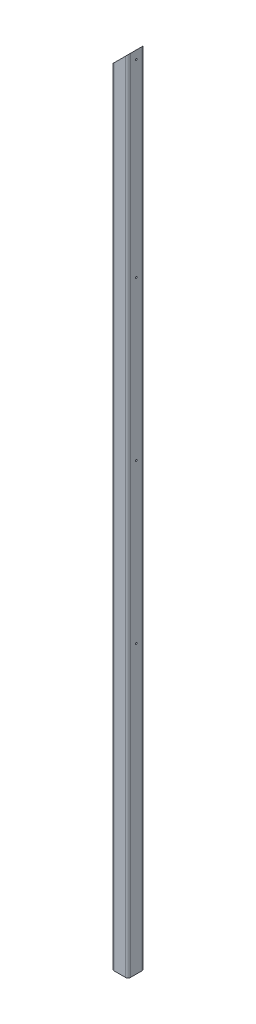
ISO-10303-21;
HEADER;
FILE_DESCRIPTION(('STEP AP214'),'2;1');
FILE_NAME('part.step','',(''),(''),'','','');
FILE_SCHEMA(('AUTOMOTIVE_DESIGN { 1 0 10303 214 1 1 1 1 }'));
ENDSEC;
DATA;
#1=APPLICATION_CONTEXT('core data for automotive mechanical design processes');
#2=APPLICATION_PROTOCOL_DEFINITION('international standard','automotive_design',2000,#1);
#3=PRODUCT_CONTEXT('',#1,'mechanical');
#4=PRODUCT('Part','Part','',(#3));
#5=PRODUCT_RELATED_PRODUCT_CATEGORY('part','',(#4));
#6=PRODUCT_DEFINITION_FORMATION('','',#4);
#7=PRODUCT_DEFINITION_CONTEXT('part definition',#1,'design');
#8=PRODUCT_DEFINITION('design','',#6,#7);
#9=PRODUCT_DEFINITION_SHAPE('','',#8);
#10=(LENGTH_UNIT() NAMED_UNIT(*) SI_UNIT(.MILLI.,.METRE.));
#11=(NAMED_UNIT(*) PLANE_ANGLE_UNIT() SI_UNIT($,.RADIAN.));
#12=(NAMED_UNIT(*) SI_UNIT($,.STERADIAN.) SOLID_ANGLE_UNIT());
#13=UNCERTAINTY_MEASURE_WITH_UNIT(LENGTH_MEASURE(1.E-05),#10,'distance_accuracy_value','');
#14=(GEOMETRIC_REPRESENTATION_CONTEXT(3) GLOBAL_UNCERTAINTY_ASSIGNED_CONTEXT((#13)) GLOBAL_UNIT_ASSIGNED_CONTEXT((#10,
#11,#12)) REPRESENTATION_CONTEXT('',''));
#15=CARTESIAN_POINT('',(0.,0.,0.));
#16=DIRECTION('',(0.,0.,1.));
#17=DIRECTION('',(1.,0.,0.));
#18=AXIS2_PLACEMENT_3D('',#15,#16,#17);
#19=CARTESIAN_POINT('',(-13.6,1920.,13.6));
#20=DIRECTION('',(0.,-1.,0.));
#21=DIRECTION('',(0.,0.,-1.));
#22=AXIS2_PLACEMENT_3D('',#19,#20,#21);
#23=CYLINDRICAL_SURFACE('',#22,6.4);
#24=CARTESIAN_POINT('',(-13.6,1886.4,13.6));
#25=DIRECTION('',(-0.707106781186548,0.707106781186547,0.));
#26=DIRECTION('',(-0.707106781186547,-0.707106781186548,0.));
#27=AXIS2_PLACEMENT_3D('',#24,#25,#26);
#28=ELLIPSE('',#27,9.05096679918782,6.4);
#29=CARTESIAN_POINT('',(-20.,1880.,13.6));
#30=VERTEX_POINT('',#29);
#31=CARTESIAN_POINT('',(-13.5999999999999,1886.4,20.));
#32=VERTEX_POINT('',#31);
#33=EDGE_CURVE('E245',#30,#32,#28,.T.);
#34=ORIENTED_EDGE('',*,*,#33,.F.);
#35=DIRECTION('',(0.,-1.,0.));
#36=VECTOR('',#35,1.);
#37=CARTESIAN_POINT('',(-20.,1920.,13.6));
#38=LINE('',#37,#36);
#39=CARTESIAN_POINT('',(-20.,0.,13.6));
#40=VERTEX_POINT('',#39);
#41=EDGE_CURVE('E161',#30,#40,#38,.T.);
#42=ORIENTED_EDGE('',*,*,#41,.T.);
#43=CARTESIAN_POINT('',(-13.6,0.,13.6));
#44=DIRECTION('',(0.,1.,0.));
#45=DIRECTION('',(0.,0.,1.));
#46=AXIS2_PLACEMENT_3D('',#43,#44,#45);
#47=CIRCLE('',#46,6.4);
#48=CARTESIAN_POINT('',(-13.6,0.,20.));
#49=VERTEX_POINT('',#48);
#50=EDGE_CURVE('E176',#40,#49,#47,.T.);
#51=ORIENTED_EDGE('',*,*,#50,.T.);
#52=DIRECTION('',(0.,-1.,0.));
#53=VECTOR('',#52,1.);
#54=CARTESIAN_POINT('',(-13.6,1920.,20.));
#55=LINE('',#54,#53);
#56=EDGE_CURVE('E12',#32,#49,#55,.T.);
#57=ORIENTED_EDGE('',*,*,#56,.F.);
#58=EDGE_LOOP('',(#34,#42,#51,#57));
#59=FACE_BOUND('',#58,.T.);
#60=ADVANCED_FACE('F66',(#59),#23,.T.);
#61=CARTESIAN_POINT('',(-13.6,1920.,20.));
#62=DIRECTION('',(0.,0.,-1.));
#63=DIRECTION('',(-1.,0.,0.));
#64=AXIS2_PLACEMENT_3D('',#61,#62,#63);
#65=PLANE('',#64);
#66=DIRECTION('',(0.707106781186547,0.707106781186548,0.));
#67=VECTOR('',#66,1.);
#68=CARTESIAN_POINT('',(-950.,950.,20.));
#69=LINE('',#68,#67);
#70=CARTESIAN_POINT('',(13.6,1913.6,20.));
#71=VERTEX_POINT('',#70);
#72=EDGE_CURVE('E350',#32,#71,#69,.T.);
#73=ORIENTED_EDGE('',*,*,#72,.F.);
#74=ORIENTED_EDGE('',*,*,#56,.T.);
#75=DIRECTION('',(1.,0.,0.));
#76=VECTOR('',#75,1.);
#77=CARTESIAN_POINT('',(-13.6,0.,20.));
#78=LINE('',#77,#76);
#79=CARTESIAN_POINT('',(13.6,0.,20.));
#80=VERTEX_POINT('',#79);
#81=EDGE_CURVE('E274',#49,#80,#78,.T.);
#82=ORIENTED_EDGE('',*,*,#81,.T.);
#83=DIRECTION('',(0.,-1.,0.));
#84=VECTOR('',#83,1.);
#85=CARTESIAN_POINT('',(13.6,1920.,20.));
#86=LINE('',#85,#84);
#87=EDGE_CURVE('E76',#71,#80,#86,.T.);
#88=ORIENTED_EDGE('',*,*,#87,.F.);
#89=EDGE_LOOP('',(#73,#74,#82,#88));
#90=FACE_BOUND('',#89,.T.);
#91=ADVANCED_FACE('F356',(#90),#65,.F.);
#92=CARTESIAN_POINT('',(13.6,1920.,13.6));
#93=DIRECTION('',(0.,-1.,0.));
#94=DIRECTION('',(0.,0.,-1.));
#95=AXIS2_PLACEMENT_3D('',#92,#93,#94);
#96=CYLINDRICAL_SURFACE('',#95,6.4);
#97=CARTESIAN_POINT('',(13.6,1913.6,13.6));
#98=DIRECTION('',(-0.707106781186548,0.707106781186547,0.));
#99=DIRECTION('',(-0.707106781186547,-0.707106781186548,0.));
#100=AXIS2_PLACEMENT_3D('',#97,#98,#99);
#101=ELLIPSE('',#100,9.05096679918782,6.4);
#102=CARTESIAN_POINT('',(20.,1920.,13.6));
#103=VERTEX_POINT('',#102);
#104=EDGE_CURVE('E93',#71,#103,#101,.T.);
#105=ORIENTED_EDGE('',*,*,#104,.F.);
#106=ORIENTED_EDGE('',*,*,#87,.T.);
#107=CARTESIAN_POINT('',(13.6,0.,13.6));
#108=DIRECTION('',(0.,1.,0.));
#109=DIRECTION('',(0.,0.,1.));
#110=AXIS2_PLACEMENT_3D('',#107,#108,#109);
#111=CIRCLE('',#110,6.4);
#112=CARTESIAN_POINT('',(20.,0.,13.6));
#113=VERTEX_POINT('',#112);
#114=EDGE_CURVE('E278',#80,#113,#111,.T.);
#115=ORIENTED_EDGE('',*,*,#114,.T.);
#116=DIRECTION('',(0.,-1.,0.));
#117=VECTOR('',#116,1.);
#118=CARTESIAN_POINT('',(20.,1920.,13.6));
#119=LINE('',#118,#117);
#120=EDGE_CURVE('E196',#103,#113,#119,.T.);
#121=ORIENTED_EDGE('',*,*,#120,.F.);
#122=EDGE_LOOP('',(#105,#106,#115,#121));
#123=FACE_BOUND('',#122,.T.);
#124=ADVANCED_FACE('F424',(#123),#96,.T.);
#125=CARTESIAN_POINT('',(13.6,1920.,-13.6));
#126=DIRECTION('',(0.,-1.,0.));
#127=DIRECTION('',(0.,0.,-1.));
#128=AXIS2_PLACEMENT_3D('',#125,#126,#127);
#129=CYLINDRICAL_SURFACE('',#128,6.4);
#130=CARTESIAN_POINT('',(13.6,1913.6,-13.6));
#131=DIRECTION('',(-0.707106781186548,0.707106781186547,0.));
#132=DIRECTION('',(-0.707106781186547,-0.707106781186548,0.));
#133=AXIS2_PLACEMENT_3D('',#130,#131,#132);
#134=ELLIPSE('',#133,9.05096679918781,6.4);
#135=CARTESIAN_POINT('',(20.,1920.,-13.6));
#136=VERTEX_POINT('',#135);
#137=CARTESIAN_POINT('',(13.6000000000003,1913.6,-20.));
#138=VERTEX_POINT('',#137);
#139=EDGE_CURVE('E303',#136,#138,#134,.T.);
#140=ORIENTED_EDGE('',*,*,#139,.F.);
#141=DIRECTION('',(0.,-1.,0.));
#142=VECTOR('',#141,1.);
#143=CARTESIAN_POINT('',(20.,1920.,-13.6));
#144=LINE('',#143,#142);
#145=CARTESIAN_POINT('',(20.,0.,-13.6));
#146=VERTEX_POINT('',#145);
#147=EDGE_CURVE('E192',#136,#146,#144,.T.);
#148=ORIENTED_EDGE('',*,*,#147,.T.);
#149=CARTESIAN_POINT('',(13.6,0.,-13.6));
#150=DIRECTION('',(0.,1.,0.));
#151=DIRECTION('',(0.,0.,1.));
#152=AXIS2_PLACEMENT_3D('',#149,#150,#151);
#153=CIRCLE('',#152,6.4);
#154=CARTESIAN_POINT('',(13.6,0.,-20.));
#155=VERTEX_POINT('',#154);
#156=EDGE_CURVE('E284',#146,#155,#153,.T.);
#157=ORIENTED_EDGE('',*,*,#156,.T.);
#158=DIRECTION('',(0.,-1.,0.));
#159=VECTOR('',#158,1.);
#160=CARTESIAN_POINT('',(13.6,1920.,-20.));
#161=LINE('',#160,#159);
#162=EDGE_CURVE('E189',#138,#155,#161,.T.);
#163=ORIENTED_EDGE('',*,*,#162,.F.);
#164=EDGE_LOOP('',(#140,#148,#157,#163));
#165=FACE_BOUND('',#164,.T.);
#166=ADVANCED_FACE('F298',(#165),#129,.T.);
#167=CARTESIAN_POINT('',(13.6,1920.,-20.));
#168=DIRECTION('',(0.,0.,1.));
#169=DIRECTION('',(1.,0.,0.));
#170=AXIS2_PLACEMENT_3D('',#167,#168,#169);
#171=PLANE('',#170);
#172=DIRECTION('',(0.707106781186547,0.707106781186548,0.));
#173=VECTOR('',#172,1.);
#174=CARTESIAN_POINT('',(-950.,950.,-20.));
#175=LINE('',#174,#173);
#176=CARTESIAN_POINT('',(-13.6,1886.4,-20.));
#177=VERTEX_POINT('',#176);
#178=EDGE_CURVE('E358',#177,#138,#175,.T.);
#179=ORIENTED_EDGE('',*,*,#178,.T.);
#180=ORIENTED_EDGE('',*,*,#162,.T.);
#181=DIRECTION('',(-1.,0.,0.));
#182=VECTOR('',#181,1.);
#183=CARTESIAN_POINT('',(13.6,0.,-20.));
#184=LINE('',#183,#182);
#185=CARTESIAN_POINT('',(-13.6,0.,-20.));
#186=VERTEX_POINT('',#185);
#187=EDGE_CURVE('E171',#155,#186,#184,.T.);
#188=ORIENTED_EDGE('',*,*,#187,.T.);
#189=DIRECTION('',(0.,-1.,0.));
#190=VECTOR('',#189,1.);
#191=CARTESIAN_POINT('',(-13.6,1920.,-20.));
#192=LINE('',#191,#190);
#193=EDGE_CURVE('E160',#177,#186,#192,.T.);
#194=ORIENTED_EDGE('',*,*,#193,.F.);
#195=EDGE_LOOP('',(#179,#180,#188,#194));
#196=FACE_BOUND('',#195,.T.);
#197=ADVANCED_FACE('F290',(#196),#171,.F.);
#198=CARTESIAN_POINT('',(-13.6,1920.,-13.6));
#199=DIRECTION('',(0.,-1.,0.));
#200=DIRECTION('',(0.,0.,-1.));
#201=AXIS2_PLACEMENT_3D('',#198,#199,#200);
#202=CYLINDRICAL_SURFACE('',#201,6.4);
#203=CARTESIAN_POINT('',(-13.6,1886.4,-13.6));
#204=DIRECTION('',(-0.707106781186548,0.707106781186547,0.));
#205=DIRECTION('',(-0.707106781186547,-0.707106781186548,0.));
#206=AXIS2_PLACEMENT_3D('',#203,#204,#205);
#207=ELLIPSE('',#206,9.05096679918782,6.4);
#208=CARTESIAN_POINT('',(-20.,1880.,-13.6));
#209=VERTEX_POINT('',#208);
#210=EDGE_CURVE('E331',#177,#209,#207,.T.);
#211=ORIENTED_EDGE('',*,*,#210,.F.);
#212=ORIENTED_EDGE('',*,*,#193,.T.);
#213=CARTESIAN_POINT('',(-13.6,0.,-13.6));
#214=DIRECTION('',(0.,1.,0.));
#215=DIRECTION('',(0.,0.,1.));
#216=AXIS2_PLACEMENT_3D('',#213,#214,#215);
#217=CIRCLE('',#216,6.4);
#218=CARTESIAN_POINT('',(-20.,0.,-13.6));
#219=VERTEX_POINT('',#218);
#220=EDGE_CURVE('E164',#186,#219,#217,.T.);
#221=ORIENTED_EDGE('',*,*,#220,.T.);
#222=DIRECTION('',(0.,-1.,0.));
#223=VECTOR('',#222,1.);
#224=CARTESIAN_POINT('',(-20.,1920.,-13.6));
#225=LINE('',#224,#223);
#226=EDGE_CURVE('E147',#209,#219,#225,.T.);
#227=ORIENTED_EDGE('',*,*,#226,.F.);
#228=EDGE_LOOP('',(#211,#212,#221,#227));
#229=FACE_BOUND('',#228,.T.);
#230=ADVANCED_FACE('F165',(#229),#202,.T.);
#231=CARTESIAN_POINT('',(13.6,1920.,13.6));
#232=DIRECTION('',(0.,-1.,0.));
#233=DIRECTION('',(0.,0.,-1.));
#234=AXIS2_PLACEMENT_3D('',#231,#232,#233);
#235=CYLINDRICAL_SURFACE('',#234,3.2);
#236=DIRECTION('',(0.,-1.,0.));
#237=VECTOR('',#236,1.);
#238=CARTESIAN_POINT('',(13.6,1920.,16.8));
#239=LINE('',#238,#237);
#240=CARTESIAN_POINT('',(13.6,1913.6,16.8));
#241=VERTEX_POINT('',#240);
#242=CARTESIAN_POINT('',(13.6,0.,16.8));
#243=VERTEX_POINT('',#242);
#244=EDGE_CURVE('E70',#241,#243,#239,.T.);
#245=ORIENTED_EDGE('',*,*,#244,.F.);
#246=CARTESIAN_POINT('',(13.6,1913.6,13.6));
#247=DIRECTION('',(-0.707106781186548,0.707106781186547,0.));
#248=DIRECTION('',(-0.707106781186547,-0.707106781186548,0.));
#249=AXIS2_PLACEMENT_3D('',#246,#247,#248);
#250=ELLIPSE('',#249,4.52548339959391,3.2);
#251=CARTESIAN_POINT('',(16.8,1916.8,13.6));
#252=VERTEX_POINT('',#251);
#253=EDGE_CURVE('E327',#241,#252,#250,.T.);
#254=ORIENTED_EDGE('',*,*,#253,.T.);
#255=DIRECTION('',(0.,-1.,0.));
#256=VECTOR('',#255,1.);
#257=CARTESIAN_POINT('',(16.8,1920.,13.6));
#258=LINE('',#257,#256);
#259=CARTESIAN_POINT('',(16.8,0.,13.6));
#260=VERTEX_POINT('',#259);
#261=EDGE_CURVE('E181',#252,#260,#258,.T.);
#262=ORIENTED_EDGE('',*,*,#261,.T.);
#263=CARTESIAN_POINT('',(13.6,0.,13.6));
#264=DIRECTION('',(0.,1.,0.));
#265=DIRECTION('',(0.,0.,1.));
#266=AXIS2_PLACEMENT_3D('',#263,#264,#265);
#267=CIRCLE('',#266,3.2);
#268=EDGE_CURVE('E239',#243,#260,#267,.T.);
#269=ORIENTED_EDGE('',*,*,#268,.F.);
#270=EDGE_LOOP('',(#245,#254,#262,#269));
#271=FACE_BOUND('',#270,.T.);
#272=ADVANCED_FACE('F68',(#271),#235,.F.);
#273=CARTESIAN_POINT('',(-13.6,1920.,16.8));
#274=DIRECTION('',(0.,0.,-1.));
#275=DIRECTION('',(-1.,0.,0.));
#276=AXIS2_PLACEMENT_3D('',#273,#274,#275);
#277=PLANE('',#276);
#278=DIRECTION('',(0.,-1.,0.));
#279=VECTOR('',#278,1.);
#280=CARTESIAN_POINT('',(-13.6,1920.,16.8));
#281=LINE('',#280,#279);
#282=CARTESIAN_POINT('',(-13.6,1886.4,16.8));
#283=VERTEX_POINT('',#282);
#284=CARTESIAN_POINT('',(-13.6,0.,16.8));
#285=VERTEX_POINT('',#284);
#286=EDGE_CURVE('E218',#283,#285,#281,.T.);
#287=ORIENTED_EDGE('',*,*,#286,.F.);
#288=DIRECTION('',(0.707106781186547,0.707106781186548,0.));
#289=VECTOR('',#288,1.);
#290=CARTESIAN_POINT('',(3.19999999999985,1903.2,16.8));
#291=LINE('',#290,#289);
#292=EDGE_CURVE('E235',#283,#241,#291,.T.);
#293=ORIENTED_EDGE('',*,*,#292,.T.);
#294=ORIENTED_EDGE('',*,*,#244,.T.);
#295=DIRECTION('',(1.,0.,0.));
#296=VECTOR('',#295,1.);
#297=CARTESIAN_POINT('',(-13.6,0.,16.8));
#298=LINE('',#297,#296);
#299=EDGE_CURVE('E232',#285,#243,#298,.T.);
#300=ORIENTED_EDGE('',*,*,#299,.F.);
#301=EDGE_LOOP('',(#287,#293,#294,#300));
#302=FACE_BOUND('',#301,.T.);
#303=ADVANCED_FACE('F230',(#302),#277,.T.);
#304=CARTESIAN_POINT('',(-13.6,1920.,13.6));
#305=DIRECTION('',(0.,-1.,0.));
#306=DIRECTION('',(0.,0.,-1.));
#307=AXIS2_PLACEMENT_3D('',#304,#305,#306);
#308=CYLINDRICAL_SURFACE('',#307,3.2);
#309=DIRECTION('',(0.,-1.,0.));
#310=VECTOR('',#309,1.);
#311=CARTESIAN_POINT('',(-16.8,1920.,13.6));
#312=LINE('',#311,#310);
#313=CARTESIAN_POINT('',(-16.8,1883.2,13.6));
#314=VERTEX_POINT('',#313);
#315=CARTESIAN_POINT('',(-16.8,0.,13.6));
#316=VERTEX_POINT('',#315);
#317=EDGE_CURVE('E216',#314,#316,#312,.T.);
#318=ORIENTED_EDGE('',*,*,#317,.F.);
#319=CARTESIAN_POINT('',(-13.6,1886.4,13.6));
#320=DIRECTION('',(-0.707106781186548,0.707106781186547,0.));
#321=DIRECTION('',(-0.707106781186547,-0.707106781186548,0.));
#322=AXIS2_PLACEMENT_3D('',#319,#320,#321);
#323=ELLIPSE('',#322,4.5254833995939,3.2);
#324=EDGE_CURVE('E336',#314,#283,#323,.T.);
#325=ORIENTED_EDGE('',*,*,#324,.T.);
#326=ORIENTED_EDGE('',*,*,#286,.T.);
#327=CARTESIAN_POINT('',(-13.6,0.,13.6));
#328=DIRECTION('',(0.,1.,0.));
#329=DIRECTION('',(0.,0.,1.));
#330=AXIS2_PLACEMENT_3D('',#327,#328,#329);
#331=CIRCLE('',#330,3.2);
#332=EDGE_CURVE('E248',#316,#285,#331,.T.);
#333=ORIENTED_EDGE('',*,*,#332,.F.);
#334=EDGE_LOOP('',(#318,#325,#326,#333));
#335=FACE_BOUND('',#334,.T.);
#336=ADVANCED_FACE('F392',(#335),#308,.F.);
#337=CARTESIAN_POINT('',(-16.8,1920.,13.6));
#338=DIRECTION('',(1.,0.,0.));
#339=DIRECTION('',(0.,0.,-1.));
#340=AXIS2_PLACEMENT_3D('',#337,#338,#339);
#341=PLANE('',#340);
#342=DIRECTION('',(0.,-1.,0.));
#343=VECTOR('',#342,1.);
#344=CARTESIAN_POINT('',(-16.8,1920.,-13.6));
#345=LINE('',#344,#343);
#346=CARTESIAN_POINT('',(-16.8,1883.2,-13.6));
#347=VERTEX_POINT('',#346);
#348=CARTESIAN_POINT('',(-16.8,0.,-13.6));
#349=VERTEX_POINT('',#348);
#350=EDGE_CURVE('E213',#347,#349,#345,.T.);
#351=ORIENTED_EDGE('',*,*,#350,.F.);
#352=DIRECTION('',(0.,0.,1.));
#353=VECTOR('',#352,1.);
#354=CARTESIAN_POINT('',(-16.8,1883.2,13.6));
#355=LINE('',#354,#353);
#356=EDGE_CURVE('E387',#347,#314,#355,.T.);
#357=ORIENTED_EDGE('',*,*,#356,.T.);
#358=ORIENTED_EDGE('',*,*,#317,.T.);
#359=DIRECTION('',(0.,0.,1.));
#360=VECTOR('',#359,1.);
#361=CARTESIAN_POINT('',(-16.8,0.,13.6));
#362=LINE('',#361,#360);
#363=EDGE_CURVE('E252',#349,#316,#362,.T.);
#364=ORIENTED_EDGE('',*,*,#363,.F.);
#365=EDGE_LOOP('',(#351,#357,#358,#364));
#366=FACE_BOUND('',#365,.T.);
#367=ADVANCED_FACE('F395',(#366),#341,.T.);
#368=CARTESIAN_POINT('',(-13.6,1920.,-13.6));
#369=DIRECTION('',(0.,-1.,0.));
#370=DIRECTION('',(0.,0.,-1.));
#371=AXIS2_PLACEMENT_3D('',#368,#369,#370);
#372=CYLINDRICAL_SURFACE('',#371,3.2);
#373=DIRECTION('',(0.,-1.,0.));
#374=VECTOR('',#373,1.);
#375=CARTESIAN_POINT('',(-13.6,1920.,-16.8));
#376=LINE('',#375,#374);
#377=CARTESIAN_POINT('',(-13.6,1886.4,-16.8));
#378=VERTEX_POINT('',#377);
#379=CARTESIAN_POINT('',(-13.6,0.,-16.8));
#380=VERTEX_POINT('',#379);
#381=EDGE_CURVE('E210',#378,#380,#376,.T.);
#382=ORIENTED_EDGE('',*,*,#381,.F.);
#383=CARTESIAN_POINT('',(-13.6,1886.4,-13.6));
#384=DIRECTION('',(-0.707106781186548,0.707106781186547,0.));
#385=DIRECTION('',(-0.707106781186547,-0.707106781186548,0.));
#386=AXIS2_PLACEMENT_3D('',#383,#384,#385);
#387=ELLIPSE('',#386,4.5254833995939,3.2);
#388=EDGE_CURVE('E383',#378,#347,#387,.T.);
#389=ORIENTED_EDGE('',*,*,#388,.T.);
#390=ORIENTED_EDGE('',*,*,#350,.T.);
#391=CARTESIAN_POINT('',(-13.6,0.,-13.6));
#392=DIRECTION('',(0.,1.,0.));
#393=DIRECTION('',(0.,0.,1.));
#394=AXIS2_PLACEMENT_3D('',#391,#392,#393);
#395=CIRCLE('',#394,3.2);
#396=EDGE_CURVE('E257',#380,#349,#395,.T.);
#397=ORIENTED_EDGE('',*,*,#396,.F.);
#398=EDGE_LOOP('',(#382,#389,#390,#397));
#399=FACE_BOUND('',#398,.T.);
#400=ADVANCED_FACE('F400',(#399),#372,.F.);
#401=CARTESIAN_POINT('',(13.6,1920.,-16.8));
#402=DIRECTION('',(0.,0.,1.));
#403=DIRECTION('',(1.,0.,0.));
#404=AXIS2_PLACEMENT_3D('',#401,#402,#403);
#405=PLANE('',#404);
#406=DIRECTION('',(0.,-1.,0.));
#407=VECTOR('',#406,1.);
#408=CARTESIAN_POINT('',(13.6,1920.,-16.8));
#409=LINE('',#408,#407);
#410=CARTESIAN_POINT('',(13.6,1913.6,-16.8));
#411=VERTEX_POINT('',#410);
#412=CARTESIAN_POINT('',(13.6,0.,-16.8));
#413=VERTEX_POINT('',#412);
#414=EDGE_CURVE('E207',#411,#413,#409,.T.);
#415=ORIENTED_EDGE('',*,*,#414,.F.);
#416=DIRECTION('',(-0.707106781186547,-0.707106781186548,0.));
#417=VECTOR('',#416,1.);
#418=CARTESIAN_POINT('',(16.7999999999999,1916.8,-16.8));
#419=LINE('',#418,#417);
#420=EDGE_CURVE('E379',#411,#378,#419,.T.);
#421=ORIENTED_EDGE('',*,*,#420,.T.);
#422=ORIENTED_EDGE('',*,*,#381,.T.);
#423=DIRECTION('',(-1.,0.,0.));
#424=VECTOR('',#423,1.);
#425=CARTESIAN_POINT('',(13.6,0.,-16.8));
#426=LINE('',#425,#424);
#427=EDGE_CURVE('E261',#413,#380,#426,.T.);
#428=ORIENTED_EDGE('',*,*,#427,.F.);
#429=EDGE_LOOP('',(#415,#421,#422,#428));
#430=FACE_BOUND('',#429,.T.);
#431=ADVANCED_FACE('F403',(#430),#405,.T.);
#432=CARTESIAN_POINT('',(13.6,1920.,-13.6));
#433=DIRECTION('',(0.,-1.,0.));
#434=DIRECTION('',(0.,0.,-1.));
#435=AXIS2_PLACEMENT_3D('',#432,#433,#434);
#436=CYLINDRICAL_SURFACE('',#435,3.2);
#437=DIRECTION('',(0.,-1.,0.));
#438=VECTOR('',#437,1.);
#439=CARTESIAN_POINT('',(16.8,1920.,-13.6));
#440=LINE('',#439,#438);
#441=CARTESIAN_POINT('',(16.8,1916.8,-13.6));
#442=VERTEX_POINT('',#441);
#443=CARTESIAN_POINT('',(16.8,0.,-13.6));
#444=VERTEX_POINT('',#443);
#445=EDGE_CURVE('E204',#442,#444,#440,.T.);
#446=ORIENTED_EDGE('',*,*,#445,.F.);
#447=CARTESIAN_POINT('',(13.6,1913.6,-13.6));
#448=DIRECTION('',(-0.707106781186548,0.707106781186547,0.));
#449=DIRECTION('',(-0.707106781186547,-0.707106781186548,0.));
#450=AXIS2_PLACEMENT_3D('',#447,#448,#449);
#451=ELLIPSE('',#450,4.5254833995939,3.2);
#452=EDGE_CURVE('E84',#442,#411,#451,.T.);
#453=ORIENTED_EDGE('',*,*,#452,.T.);
#454=ORIENTED_EDGE('',*,*,#414,.T.);
#455=CARTESIAN_POINT('',(13.6,0.,-13.6));
#456=DIRECTION('',(0.,1.,0.));
#457=DIRECTION('',(0.,0.,1.));
#458=AXIS2_PLACEMENT_3D('',#455,#456,#457);
#459=CIRCLE('',#458,3.2);
#460=EDGE_CURVE('E265',#444,#413,#459,.T.);
#461=ORIENTED_EDGE('',*,*,#460,.F.);
#462=EDGE_LOOP('',(#446,#453,#454,#461));
#463=FACE_BOUND('',#462,.T.);
#464=ADVANCED_FACE('F408',(#463),#436,.F.);
#465=CARTESIAN_POINT('',(16.8,1920.,-13.6));
#466=DIRECTION('',(-1.,0.,0.));
#467=DIRECTION('',(0.,0.,1.));
#468=AXIS2_PLACEMENT_3D('',#465,#466,#467);
#469=PLANE('',#468);
#470=ORIENTED_EDGE('',*,*,#261,.F.);
#471=DIRECTION('',(0.,0.,-1.));
#472=VECTOR('',#471,1.);
#473=CARTESIAN_POINT('',(16.8,1916.8,-13.6));
#474=LINE('',#473,#472);
#475=EDGE_CURVE('E329',#252,#442,#474,.T.);
#476=ORIENTED_EDGE('',*,*,#475,.T.);
#477=ORIENTED_EDGE('',*,*,#445,.T.);
#478=DIRECTION('',(0.,0.,-1.));
#479=VECTOR('',#478,1.);
#480=CARTESIAN_POINT('',(16.8,0.,-13.6));
#481=LINE('',#480,#479);
#482=EDGE_CURVE('E269',#260,#444,#481,.T.);
#483=ORIENTED_EDGE('',*,*,#482,.F.);
#484=EDGE_LOOP('',(#470,#476,#477,#483));
#485=FACE_BOUND('',#484,.T.);
#486=ADVANCED_FACE('F410',(#485),#469,.T.);
#487=CARTESIAN_POINT('',(-20.,1920.,13.6));
#488=DIRECTION('',(1.,0.,0.));
#489=DIRECTION('',(0.,0.,-1.));
#490=AXIS2_PLACEMENT_3D('',#487,#488,#489);
#491=PLANE('',#490);
#492=DIRECTION('',(0.,0.,-1.));
#493=VECTOR('',#492,1.);
#494=CARTESIAN_POINT('',(-20.,1880.,20.));
#495=LINE('',#494,#493);
#496=EDGE_CURVE('E156',#30,#209,#495,.T.);
#497=ORIENTED_EDGE('',*,*,#496,.T.);
#498=ORIENTED_EDGE('',*,*,#226,.T.);
#499=DIRECTION('',(0.,0.,1.));
#500=VECTOR('',#499,1.);
#501=CARTESIAN_POINT('',(-20.,0.,13.6));
#502=LINE('',#501,#500);
#503=EDGE_CURVE('E152',#219,#40,#502,.T.);
#504=ORIENTED_EDGE('',*,*,#503,.T.);
#505=ORIENTED_EDGE('',*,*,#41,.F.);
#506=EDGE_LOOP('',(#497,#498,#504,#505));
#507=FACE_BOUND('',#506,.T.);
#508=ADVANCED_FACE('F149',(#507),#491,.F.);
#509=CARTESIAN_POINT('',(20.,1920.,-13.6));
#510=DIRECTION('',(-1.,0.,0.));
#511=DIRECTION('',(0.,0.,1.));
#512=AXIS2_PLACEMENT_3D('',#509,#510,#511);
#513=PLANE('',#512);
#514=CARTESIAN_POINT('',(20.,1900.,0.));
#515=DIRECTION('',(1.,0.,0.));
#516=DIRECTION('',(0.,0.,-1.));
#517=AXIS2_PLACEMENT_3D('',#514,#515,#516);
#518=CIRCLE('',#517,2.);
#519=CARTESIAN_POINT('',(20.,1900.,-2.00000000000001));
#520=VERTEX_POINT('',#519);
#521=EDGE_CURVE('E369',#520,#520,#518,.T.);
#522=ORIENTED_EDGE('',*,*,#521,.F.);
#523=EDGE_LOOP('',(#522));
#524=FACE_BOUND('',#523,.T.);
#525=CARTESIAN_POINT('',(20.,1447.,0.));
#526=DIRECTION('',(1.,0.,0.));
#527=DIRECTION('',(0.,0.,-1.));
#528=AXIS2_PLACEMENT_3D('',#525,#526,#527);
#529=CIRCLE('',#528,2.);
#530=CARTESIAN_POINT('',(20.,1447.,-2.00000000000007));
#531=VERTEX_POINT('',#530);
#532=EDGE_CURVE('E485',#531,#531,#529,.T.);
#533=ORIENTED_EDGE('',*,*,#532,.F.);
#534=EDGE_LOOP('',(#533));
#535=FACE_BOUND('',#534,.T.);
#536=CARTESIAN_POINT('',(20.,1067.,-1.10920259905105E-13));
#537=DIRECTION('',(1.,0.,0.));
#538=DIRECTION('',(0.,0.,-1.));
#539=AXIS2_PLACEMENT_3D('',#536,#537,#538);
#540=CIRCLE('',#539,2.);
#541=CARTESIAN_POINT('',(20.,1067.,-2.00000000000011));
#542=VERTEX_POINT('',#541);
#543=EDGE_CURVE('E495',#542,#542,#540,.T.);
#544=ORIENTED_EDGE('',*,*,#543,.F.);
#545=EDGE_LOOP('',(#544));
#546=FACE_BOUND('',#545,.T.);
#547=CARTESIAN_POINT('',(20.,687.,-1.57757793756479E-13));
#548=DIRECTION('',(1.,0.,0.));
#549=DIRECTION('',(0.,0.,-1.));
#550=AXIS2_PLACEMENT_3D('',#547,#548,#549);
#551=CIRCLE('',#550,2.);
#552=CARTESIAN_POINT('',(20.,687.,-2.00000000000016));
#553=VERTEX_POINT('',#552);
#554=EDGE_CURVE('E502',#553,#553,#551,.T.);
#555=ORIENTED_EDGE('',*,*,#554,.F.);
#556=EDGE_LOOP('',(#555));
#557=FACE_BOUND('',#556,.T.);
#558=DIRECTION('',(0.,0.,-1.));
#559=VECTOR('',#558,1.);
#560=CARTESIAN_POINT('',(20.,0.,-13.6));
#561=LINE('',#560,#559);
#562=EDGE_CURVE('E281',#113,#146,#561,.T.);
#563=ORIENTED_EDGE('',*,*,#562,.T.);
#564=ORIENTED_EDGE('',*,*,#147,.F.);
#565=DIRECTION('',(0.,0.,-1.));
#566=VECTOR('',#565,1.);
#567=CARTESIAN_POINT('',(20.,1920.,-13.6));
#568=LINE('',#567,#566);
#569=EDGE_CURVE('E178',#103,#136,#568,.T.);
#570=ORIENTED_EDGE('',*,*,#569,.F.);
#571=ORIENTED_EDGE('',*,*,#120,.T.);
#572=EDGE_LOOP('',(#563,#564,#570,#571));
#573=FACE_BOUND('',#572,.T.);
#574=ADVANCED_FACE('F306',(#524,#535,#546,#557,#573),#513,.F.);
#575=CARTESIAN_POINT('',(-13.6,0.,13.6));
#576=DIRECTION('',(0.,1.,0.));
#577=DIRECTION('',(0.,0.,1.));
#578=AXIS2_PLACEMENT_3D('',#575,#576,#577);
#579=PLANE('',#578);
#580=ORIENTED_EDGE('',*,*,#268,.T.);
#581=ORIENTED_EDGE('',*,*,#482,.T.);
#582=ORIENTED_EDGE('',*,*,#460,.T.);
#583=ORIENTED_EDGE('',*,*,#427,.T.);
#584=ORIENTED_EDGE('',*,*,#396,.T.);
#585=ORIENTED_EDGE('',*,*,#363,.T.);
#586=ORIENTED_EDGE('',*,*,#332,.T.);
#587=ORIENTED_EDGE('',*,*,#299,.T.);
#588=EDGE_LOOP('',(#580,#581,#582,#583,#584,#585,#586,#587));
#589=FACE_BOUND('',#588,.T.);
#590=ORIENTED_EDGE('',*,*,#50,.F.);
#591=ORIENTED_EDGE('',*,*,#503,.F.);
#592=ORIENTED_EDGE('',*,*,#220,.F.);
#593=ORIENTED_EDGE('',*,*,#187,.F.);
#594=ORIENTED_EDGE('',*,*,#156,.F.);
#595=ORIENTED_EDGE('',*,*,#562,.F.);
#596=ORIENTED_EDGE('',*,*,#114,.F.);
#597=ORIENTED_EDGE('',*,*,#81,.F.);
#598=EDGE_LOOP('',(#590,#591,#592,#593,#594,#595,#596,#597));
#599=FACE_BOUND('',#598,.T.);
#600=ADVANCED_FACE('F173',(#589,#599),#579,.F.);
#601=CARTESIAN_POINT('',(-950.,950.,20.));
#602=DIRECTION('',(-0.707106781186548,0.707106781186547,0.));
#603=DIRECTION('',(-0.707106781186547,-0.707106781186548,0.));
#604=AXIS2_PLACEMENT_3D('',#601,#602,#603);
#605=PLANE('',#604);
#606=ORIENTED_EDGE('',*,*,#292,.F.);
#607=ORIENTED_EDGE('',*,*,#324,.F.);
#608=ORIENTED_EDGE('',*,*,#356,.F.);
#609=ORIENTED_EDGE('',*,*,#388,.F.);
#610=ORIENTED_EDGE('',*,*,#420,.F.);
#611=ORIENTED_EDGE('',*,*,#452,.F.);
#612=ORIENTED_EDGE('',*,*,#475,.F.);
#613=ORIENTED_EDGE('',*,*,#253,.F.);
#614=EDGE_LOOP('',(#606,#607,#608,#609,#610,#611,#612,#613));
#615=FACE_BOUND('',#614,.T.);
#616=ORIENTED_EDGE('',*,*,#33,.T.);
#617=ORIENTED_EDGE('',*,*,#72,.T.);
#618=ORIENTED_EDGE('',*,*,#104,.T.);
#619=ORIENTED_EDGE('',*,*,#569,.T.);
#620=ORIENTED_EDGE('',*,*,#139,.T.);
#621=ORIENTED_EDGE('',*,*,#178,.F.);
#622=ORIENTED_EDGE('',*,*,#210,.T.);
#623=ORIENTED_EDGE('',*,*,#496,.F.);
#624=EDGE_LOOP('',(#616,#617,#618,#619,#620,#621,#622,#623));
#625=FACE_BOUND('',#624,.T.);
#626=ADVANCED_FACE('F328',(#615,#625),#605,.T.);
#627=CARTESIAN_POINT('',(17.,687.,-1.56992474575901E-13));
#628=DIRECTION('',(1.,0.,0.));
#629=DIRECTION('',(0.,0.,-1.));
#630=AXIS2_PLACEMENT_3D('',#627,#628,#629);
#631=CYLINDRICAL_SURFACE('',#630,2.);
#632=CARTESIAN_POINT('',(17.,687.,-1.56992474575901E-13));
#633=DIRECTION('',(1.,0.,0.));
#634=DIRECTION('',(0.,0.,-1.));
#635=AXIS2_PLACEMENT_3D('',#632,#633,#634);
#636=CIRCLE('',#635,2.);
#637=CARTESIAN_POINT('',(17.,687.,-2.00000000000016));
#638=VERTEX_POINT('',#637);
#639=EDGE_CURVE('E499',#638,#638,#636,.T.);
#640=ORIENTED_EDGE('',*,*,#639,.F.);
#641=EDGE_LOOP('',(#640));
#642=FACE_BOUND('',#641,.T.);
#643=ORIENTED_EDGE('',*,*,#554,.T.);
#644=EDGE_LOOP('',(#643));
#645=FACE_BOUND('',#644,.T.);
#646=ADVANCED_FACE('F443',(#642,#645),#631,.F.);
#647=CARTESIAN_POINT('',(17.,687.,-1.56992474575901E-13));
#648=DIRECTION('',(1.,0.,0.));
#649=DIRECTION('',(0.,0.,-1.));
#650=AXIS2_PLACEMENT_3D('',#647,#648,#649);
#651=PLANE('',#650);
#652=ORIENTED_EDGE('',*,*,#639,.T.);
#653=EDGE_LOOP('',(#652));
#654=FACE_BOUND('',#653,.T.);
#655=ADVANCED_FACE('F446',(#654),#651,.T.);
#656=CARTESIAN_POINT('',(17.,1067.,-1.10154940724527E-13));
#657=DIRECTION('',(1.,0.,0.));
#658=DIRECTION('',(0.,0.,-1.));
#659=AXIS2_PLACEMENT_3D('',#656,#657,#658);
#660=CYLINDRICAL_SURFACE('',#659,2.);
#661=CARTESIAN_POINT('',(17.,1067.,-1.10154940724527E-13));
#662=DIRECTION('',(1.,0.,0.));
#663=DIRECTION('',(0.,0.,-1.));
#664=AXIS2_PLACEMENT_3D('',#661,#662,#663);
#665=CIRCLE('',#664,2.);
#666=CARTESIAN_POINT('',(17.,1067.,-2.00000000000011));
#667=VERTEX_POINT('',#666);
#668=EDGE_CURVE('E491',#667,#667,#665,.T.);
#669=ORIENTED_EDGE('',*,*,#668,.F.);
#670=EDGE_LOOP('',(#669));
#671=FACE_BOUND('',#670,.T.);
#672=ORIENTED_EDGE('',*,*,#543,.T.);
#673=EDGE_LOOP('',(#672));
#674=FACE_BOUND('',#673,.T.);
#675=ADVANCED_FACE('F450',(#671,#674),#660,.F.);
#676=CARTESIAN_POINT('',(17.,1067.,-1.10154940724527E-13));
#677=DIRECTION('',(1.,0.,0.));
#678=DIRECTION('',(0.,0.,-1.));
#679=AXIS2_PLACEMENT_3D('',#676,#677,#678);
#680=PLANE('',#679);
#681=ORIENTED_EDGE('',*,*,#668,.T.);
#682=EDGE_LOOP('',(#681));
#683=FACE_BOUND('',#682,.T.);
#684=ADVANCED_FACE('F454',(#683),#680,.T.);
#685=CARTESIAN_POINT('',(17.,1447.,0.));
#686=DIRECTION('',(1.,0.,0.));
#687=DIRECTION('',(0.,0.,-1.));
#688=AXIS2_PLACEMENT_3D('',#685,#686,#687);
#689=CYLINDRICAL_SURFACE('',#688,2.);
#690=CARTESIAN_POINT('',(17.,1447.,0.));
#691=DIRECTION('',(1.,0.,0.));
#692=DIRECTION('',(0.,0.,-1.));
#693=AXIS2_PLACEMENT_3D('',#690,#691,#692);
#694=CIRCLE('',#693,2.);
#695=CARTESIAN_POINT('',(17.,1447.,-2.00000000000006));
#696=VERTEX_POINT('',#695);
#697=EDGE_CURVE('E481',#696,#696,#694,.T.);
#698=ORIENTED_EDGE('',*,*,#697,.F.);
#699=EDGE_LOOP('',(#698));
#700=FACE_BOUND('',#699,.T.);
#701=ORIENTED_EDGE('',*,*,#532,.T.);
#702=EDGE_LOOP('',(#701));
#703=FACE_BOUND('',#702,.T.);
#704=ADVANCED_FACE('F458',(#700,#703),#689,.F.);
#705=CARTESIAN_POINT('',(17.,1447.,0.));
#706=DIRECTION('',(1.,0.,0.));
#707=DIRECTION('',(0.,0.,-1.));
#708=AXIS2_PLACEMENT_3D('',#705,#706,#707);
#709=PLANE('',#708);
#710=ORIENTED_EDGE('',*,*,#697,.T.);
#711=EDGE_LOOP('',(#710));
#712=FACE_BOUND('',#711,.T.);
#713=ADVANCED_FACE('F462',(#712),#709,.T.);
#714=CARTESIAN_POINT('',(17.,1900.,0.));
#715=DIRECTION('',(1.,0.,0.));
#716=DIRECTION('',(0.,0.,-1.));
#717=AXIS2_PLACEMENT_3D('',#714,#715,#716);
#718=CYLINDRICAL_SURFACE('',#717,2.);
#719=CARTESIAN_POINT('',(17.,1900.,0.));
#720=DIRECTION('',(1.,0.,0.));
#721=DIRECTION('',(0.,0.,-1.));
#722=AXIS2_PLACEMENT_3D('',#719,#720,#721);
#723=CIRCLE('',#722,2.);
#724=CARTESIAN_POINT('',(17.,1900.,-2.00000000000001));
#725=VERTEX_POINT('',#724);
#726=EDGE_CURVE('E365',#725,#725,#723,.T.);
#727=ORIENTED_EDGE('',*,*,#726,.F.);
#728=EDGE_LOOP('',(#727));
#729=FACE_BOUND('',#728,.T.);
#730=ORIENTED_EDGE('',*,*,#521,.T.);
#731=EDGE_LOOP('',(#730));
#732=FACE_BOUND('',#731,.T.);
#733=ADVANCED_FACE('F466',(#729,#732),#718,.F.);
#734=CARTESIAN_POINT('',(17.,1900.,0.));
#735=DIRECTION('',(1.,0.,0.));
#736=DIRECTION('',(0.,0.,-1.));
#737=AXIS2_PLACEMENT_3D('',#734,#735,#736);
#738=PLANE('',#737);
#739=ORIENTED_EDGE('',*,*,#726,.T.);
#740=EDGE_LOOP('',(#739));
#741=FACE_BOUND('',#740,.T.);
#742=ADVANCED_FACE('F470',(#741),#738,.T.);
#743=CLOSED_SHELL('',(#60,#91,#124,#166,#197,#230,#272,#303,#336,#367,#400,#431,#464,#486,#508,
#574,#600,#626,#646,#655,#675,#684,#704,#713,#733,#742));
#744=MANIFOLD_SOLID_BREP('B2',#743);
#745=ADVANCED_BREP_SHAPE_REPRESENTATION('',(#18,#744),#14);
#746=SHAPE_DEFINITION_REPRESENTATION(#9,#745);
ENDSEC;
END-ISO-10303-21;
